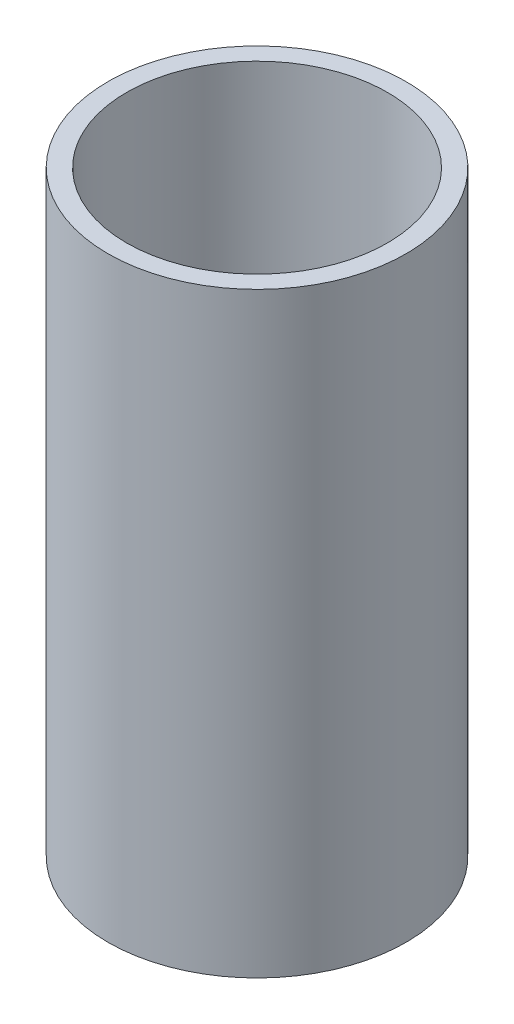
ISO-10303-21;
HEADER;
FILE_DESCRIPTION(('STEP AP214'),'2;1');
FILE_NAME('part.step','',(''),(''),'','','');
FILE_SCHEMA(('AUTOMOTIVE_DESIGN { 1 0 10303 214 1 1 1 1 }'));
ENDSEC;
DATA;
#1=APPLICATION_CONTEXT('core data for automotive mechanical design processes');
#2=APPLICATION_PROTOCOL_DEFINITION('international standard','automotive_design',2000,#1);
#3=PRODUCT_CONTEXT('',#1,'mechanical');
#4=PRODUCT('Part','Part','',(#3));
#5=PRODUCT_RELATED_PRODUCT_CATEGORY('part','',(#4));
#6=PRODUCT_DEFINITION_FORMATION('','',#4);
#7=PRODUCT_DEFINITION_CONTEXT('part definition',#1,'design');
#8=PRODUCT_DEFINITION('design','',#6,#7);
#9=PRODUCT_DEFINITION_SHAPE('','',#8);
#10=(LENGTH_UNIT() NAMED_UNIT(*) SI_UNIT(.MILLI.,.METRE.));
#11=(NAMED_UNIT(*) PLANE_ANGLE_UNIT() SI_UNIT($,.RADIAN.));
#12=(NAMED_UNIT(*) SI_UNIT($,.STERADIAN.) SOLID_ANGLE_UNIT());
#13=UNCERTAINTY_MEASURE_WITH_UNIT(LENGTH_MEASURE(1.E-05),#10,'distance_accuracy_value','');
#14=(GEOMETRIC_REPRESENTATION_CONTEXT(3) GLOBAL_UNCERTAINTY_ASSIGNED_CONTEXT((#13)) GLOBAL_UNIT_ASSIGNED_CONTEXT((#10,
#11,#12)) REPRESENTATION_CONTEXT('',''));
#15=CARTESIAN_POINT('',(0.,0.,0.));
#16=DIRECTION('',(0.,0.,1.));
#17=DIRECTION('',(1.,0.,0.));
#18=AXIS2_PLACEMENT_3D('',#15,#16,#17);
#19=CARTESIAN_POINT('',(0.,50.8,0.));
#20=DIRECTION('',(0.,-1.,0.));
#21=DIRECTION('',(0.,0.,-1.));
#22=AXIS2_PLACEMENT_3D('',#19,#20,#21);
#23=CYLINDRICAL_SURFACE('',#22,12.7);
#24=CARTESIAN_POINT('',(0.,50.8,0.));
#25=DIRECTION('',(0.,1.,0.));
#26=DIRECTION('',(0.,0.,1.));
#27=AXIS2_PLACEMENT_3D('',#24,#25,#26);
#28=CIRCLE('',#27,12.7);
#29=CARTESIAN_POINT('',(0.,50.8,12.7));
#30=VERTEX_POINT('',#29);
#31=EDGE_CURVE('E10',#30,#30,#28,.T.);
#32=ORIENTED_EDGE('',*,*,#31,.F.);
#33=EDGE_LOOP('',(#32));
#34=FACE_BOUND('',#33,.T.);
#35=CARTESIAN_POINT('',(0.,0.,0.));
#36=DIRECTION('',(0.,1.,0.));
#37=DIRECTION('',(0.,0.,1.));
#38=AXIS2_PLACEMENT_3D('',#35,#36,#37);
#39=CIRCLE('',#38,12.7);
#40=CARTESIAN_POINT('',(0.,0.,12.7));
#41=VERTEX_POINT('',#40);
#42=EDGE_CURVE('E43',#41,#41,#39,.T.);
#43=ORIENTED_EDGE('',*,*,#42,.T.);
#44=EDGE_LOOP('',(#43));
#45=FACE_BOUND('',#44,.T.);
#46=ADVANCED_FACE('F40',(#34,#45),#23,.T.);
#47=CARTESIAN_POINT('',(0.,50.8,0.));
#48=DIRECTION('',(0.,1.,0.));
#49=DIRECTION('',(0.,0.,1.));
#50=AXIS2_PLACEMENT_3D('',#47,#48,#49);
#51=PLANE('',#50);
#52=CARTESIAN_POINT('',(0.,50.8,0.));
#53=DIRECTION('',(0.,1.,0.));
#54=DIRECTION('',(0.,0.,1.));
#55=AXIS2_PLACEMENT_3D('',#52,#53,#54);
#56=CIRCLE('',#55,11.1125);
#57=CARTESIAN_POINT('',(0.,50.8,11.1125));
#58=VERTEX_POINT('',#57);
#59=EDGE_CURVE('E54',#58,#58,#56,.T.);
#60=ORIENTED_EDGE('',*,*,#59,.F.);
#61=EDGE_LOOP('',(#60));
#62=FACE_BOUND('',#61,.T.);
#63=ORIENTED_EDGE('',*,*,#31,.T.);
#64=EDGE_LOOP('',(#63));
#65=FACE_BOUND('',#64,.T.);
#66=ADVANCED_FACE('F71',(#62,#65),#51,.T.);
#67=CARTESIAN_POINT('',(0.,0.,0.));
#68=DIRECTION('',(0.,1.,0.));
#69=DIRECTION('',(0.,0.,1.));
#70=AXIS2_PLACEMENT_3D('',#67,#68,#69);
#71=PLANE('',#70);
#72=ORIENTED_EDGE('',*,*,#42,.F.);
#73=EDGE_LOOP('',(#72));
#74=FACE_BOUND('',#73,.T.);
#75=ADVANCED_FACE('F67',(#74),#71,.F.);
#76=CARTESIAN_POINT('',(0.,6.35,0.));
#77=DIRECTION('',(0.,1.,0.));
#78=DIRECTION('',(0.,0.,1.));
#79=AXIS2_PLACEMENT_3D('',#76,#77,#78);
#80=CYLINDRICAL_SURFACE('',#79,11.1125);
#81=CARTESIAN_POINT('',(0.,6.35,0.));
#82=DIRECTION('',(0.,1.,0.));
#83=DIRECTION('',(0.,0.,1.));
#84=AXIS2_PLACEMENT_3D('',#81,#82,#83);
#85=CIRCLE('',#84,11.1125);
#86=CARTESIAN_POINT('',(0.,6.35,11.1125));
#87=VERTEX_POINT('',#86);
#88=EDGE_CURVE('E52',#87,#87,#85,.T.);
#89=ORIENTED_EDGE('',*,*,#88,.F.);
#90=EDGE_LOOP('',(#89));
#91=FACE_BOUND('',#90,.T.);
#92=ORIENTED_EDGE('',*,*,#59,.T.);
#93=EDGE_LOOP('',(#92));
#94=FACE_BOUND('',#93,.T.);
#95=ADVANCED_FACE('F64',(#91,#94),#80,.F.);
#96=CARTESIAN_POINT('',(0.,6.35,0.));
#97=DIRECTION('',(0.,1.,0.));
#98=DIRECTION('',(0.,0.,1.));
#99=AXIS2_PLACEMENT_3D('',#96,#97,#98);
#100=PLANE('',#99);
#101=ORIENTED_EDGE('',*,*,#88,.T.);
#102=EDGE_LOOP('',(#101));
#103=FACE_BOUND('',#102,.T.);
#104=ADVANCED_FACE('F62',(#103),#100,.T.);
#105=CLOSED_SHELL('',(#46,#66,#75,#95,#104));
#106=MANIFOLD_SOLID_BREP('B2',#105);
#107=ADVANCED_BREP_SHAPE_REPRESENTATION('',(#18,#106),#14);
#108=SHAPE_DEFINITION_REPRESENTATION(#9,#107);
ENDSEC;
END-ISO-10303-21;
